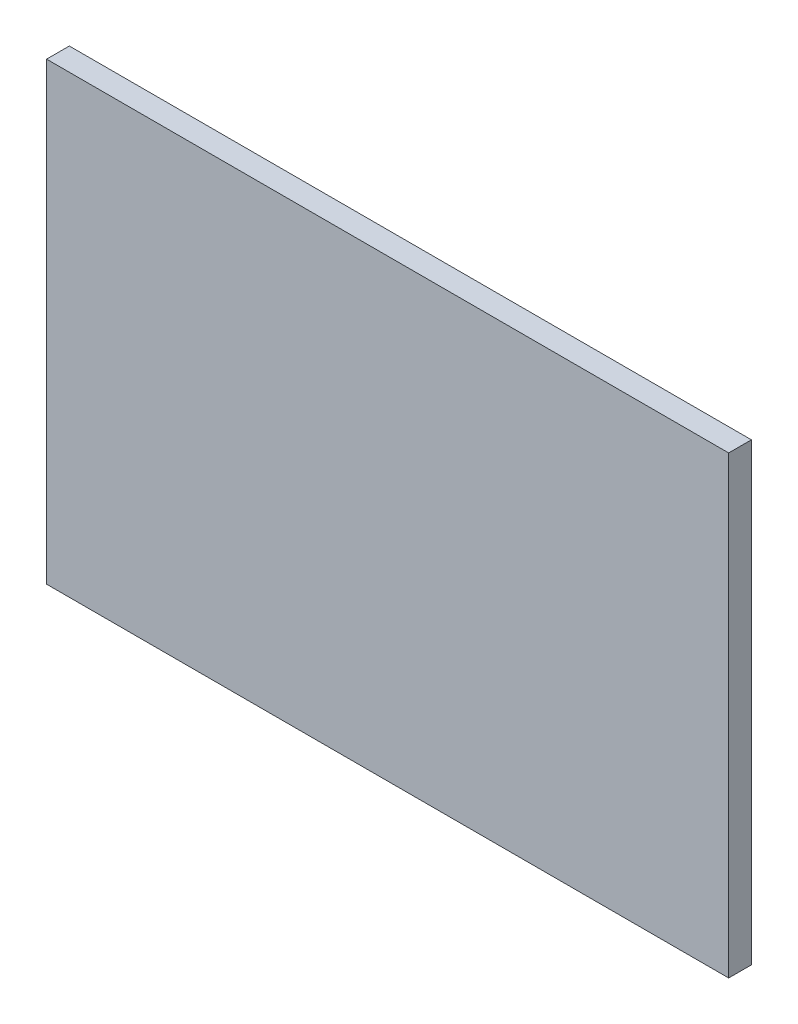
ISO-10303-21;
HEADER;
FILE_DESCRIPTION(('STEP AP214'),'2;1');
FILE_NAME('part.step','',(''),(''),'','','');
FILE_SCHEMA(('AUTOMOTIVE_DESIGN { 1 0 10303 214 1 1 1 1 }'));
ENDSEC;
DATA;
#1=APPLICATION_CONTEXT('core data for automotive mechanical design processes');
#2=APPLICATION_PROTOCOL_DEFINITION('international standard','automotive_design',2000,#1);
#3=PRODUCT_CONTEXT('',#1,'mechanical');
#4=PRODUCT('Part','Part','',(#3));
#5=PRODUCT_RELATED_PRODUCT_CATEGORY('part','',(#4));
#6=PRODUCT_DEFINITION_FORMATION('','',#4);
#7=PRODUCT_DEFINITION_CONTEXT('part definition',#1,'design');
#8=PRODUCT_DEFINITION('design','',#6,#7);
#9=PRODUCT_DEFINITION_SHAPE('','',#8);
#10=(LENGTH_UNIT() NAMED_UNIT(*) SI_UNIT(.MILLI.,.METRE.));
#11=(NAMED_UNIT(*) PLANE_ANGLE_UNIT() SI_UNIT($,.RADIAN.));
#12=(NAMED_UNIT(*) SI_UNIT($,.STERADIAN.) SOLID_ANGLE_UNIT());
#13=UNCERTAINTY_MEASURE_WITH_UNIT(LENGTH_MEASURE(1.E-05),#10,'distance_accuracy_value','');
#14=(GEOMETRIC_REPRESENTATION_CONTEXT(3) GLOBAL_UNCERTAINTY_ASSIGNED_CONTEXT((#13)) GLOBAL_UNIT_ASSIGNED_CONTEXT((#10,
#11,#12)) REPRESENTATION_CONTEXT('',''));
#15=CARTESIAN_POINT('',(0.,0.,0.));
#16=DIRECTION('',(0.,0.,1.));
#17=DIRECTION('',(1.,0.,0.));
#18=AXIS2_PLACEMENT_3D('',#15,#16,#17);
#19=CARTESIAN_POINT('',(0.,0.,1.));
#20=DIRECTION('',(0.,0.,1.));
#21=DIRECTION('',(0.,-1.,0.));
#22=AXIS2_PLACEMENT_3D('',#19,#20,#21);
#23=PLANE('',#22);
#24=DIRECTION('',(1.,0.,0.));
#25=VECTOR('',#24,1.);
#26=CARTESIAN_POINT('',(15.,9.99999999999996,0.999999999999965));
#27=LINE('',#26,#25);
#28=CARTESIAN_POINT('',(-15.,10.0000000000001,0.999999999999965));
#29=VERTEX_POINT('',#28);
#30=CARTESIAN_POINT('',(15.,9.99999999999996,0.999999999999965));
#31=VERTEX_POINT('',#30);
#32=EDGE_CURVE('E127',#29,#31,#27,.T.);
#33=ORIENTED_EDGE('',*,*,#32,.F.);
#34=DIRECTION('',(0.,1.,0.));
#35=VECTOR('',#34,1.);
#36=CARTESIAN_POINT('',(-15.,10.0000000000001,0.999999999999965));
#37=LINE('',#36,#35);
#38=CARTESIAN_POINT('',(-15.,-9.99999999999995,1.00000000000003));
#39=VERTEX_POINT('',#38);
#40=EDGE_CURVE('E125',#39,#29,#37,.T.);
#41=ORIENTED_EDGE('',*,*,#40,.F.);
#42=DIRECTION('',(-1.,0.,0.));
#43=VECTOR('',#42,1.);
#44=CARTESIAN_POINT('',(-15.,-9.99999999999995,1.00000000000003));
#45=LINE('',#44,#43);
#46=CARTESIAN_POINT('',(15.,-10.,1.00000000000003));
#47=VERTEX_POINT('',#46);
#48=EDGE_CURVE('E61',#47,#39,#45,.T.);
#49=ORIENTED_EDGE('',*,*,#48,.F.);
#50=DIRECTION('',(0.,-1.,0.));
#51=VECTOR('',#50,1.);
#52=CARTESIAN_POINT('',(15.,-10.,1.00000000000003));
#53=LINE('',#52,#51);
#54=EDGE_CURVE('E12',#31,#47,#53,.T.);
#55=ORIENTED_EDGE('',*,*,#54,.F.);
#56=EDGE_LOOP('',(#33,#41,#49,#55));
#57=FACE_BOUND('',#56,.T.);
#58=ADVANCED_FACE('F51',(#57),#23,.T.);
#59=CARTESIAN_POINT('',(0.,0.,0.));
#60=DIRECTION('',(0.,0.,1.));
#61=DIRECTION('',(1.,0.,0.));
#62=AXIS2_PLACEMENT_3D('',#59,#60,#61);
#63=PLANE('',#62);
#64=DIRECTION('',(-1.,0.,0.));
#65=VECTOR('',#64,1.);
#66=CARTESIAN_POINT('',(15.,10.,0.));
#67=LINE('',#66,#65);
#68=CARTESIAN_POINT('',(15.,10.,0.));
#69=VERTEX_POINT('',#68);
#70=CARTESIAN_POINT('',(-15.,10.,0.));
#71=VERTEX_POINT('',#70);
#72=EDGE_CURVE('E100',#69,#71,#67,.T.);
#73=ORIENTED_EDGE('',*,*,#72,.F.);
#74=DIRECTION('',(0.,1.,0.));
#75=VECTOR('',#74,1.);
#76=CARTESIAN_POINT('',(15.,-10.,0.));
#77=LINE('',#76,#75);
#78=CARTESIAN_POINT('',(15.,-10.,0.));
#79=VERTEX_POINT('',#78);
#80=EDGE_CURVE('E179',#79,#69,#77,.T.);
#81=ORIENTED_EDGE('',*,*,#80,.F.);
#82=DIRECTION('',(1.,0.,0.));
#83=VECTOR('',#82,1.);
#84=CARTESIAN_POINT('',(-15.,-10.,0.));
#85=LINE('',#84,#83);
#86=CARTESIAN_POINT('',(-15.,-10.,0.));
#87=VERTEX_POINT('',#86);
#88=EDGE_CURVE('E102',#87,#79,#85,.T.);
#89=ORIENTED_EDGE('',*,*,#88,.F.);
#90=DIRECTION('',(0.,-1.,0.));
#91=VECTOR('',#90,1.);
#92=CARTESIAN_POINT('',(-15.,10.,0.));
#93=LINE('',#92,#91);
#94=EDGE_CURVE('E96',#71,#87,#93,.T.);
#95=ORIENTED_EDGE('',*,*,#94,.F.);
#96=EDGE_LOOP('',(#73,#81,#89,#95));
#97=FACE_BOUND('',#96,.T.);
#98=ADVANCED_FACE('F99',(#97),#63,.F.);
#99=CARTESIAN_POINT('',(0.,-9.99999999999995,-4.6837533851372E-13));
#100=DIRECTION('',(0.,-1.,0.));
#101=DIRECTION('',(0.,0.,-1.));
#102=AXIS2_PLACEMENT_3D('',#99,#100,#101);
#103=PLANE('',#102);
#104=DIRECTION('',(0.,0.,1.));
#105=VECTOR('',#104,1.);
#106=CARTESIAN_POINT('',(15.,-10.,0.));
#107=LINE('',#106,#105);
#108=EDGE_CURVE('E76',#79,#47,#107,.T.);
#109=ORIENTED_EDGE('',*,*,#108,.T.);
#110=ORIENTED_EDGE('',*,*,#48,.T.);
#111=DIRECTION('',(0.,0.,1.));
#112=VECTOR('',#111,1.);
#113=CARTESIAN_POINT('',(-15.,-10.,0.));
#114=LINE('',#113,#112);
#115=EDGE_CURVE('E130',#87,#39,#114,.T.);
#116=ORIENTED_EDGE('',*,*,#115,.F.);
#117=ORIENTED_EDGE('',*,*,#88,.T.);
#118=EDGE_LOOP('',(#109,#110,#116,#117));
#119=FACE_BOUND('',#118,.T.);
#120=ADVANCED_FACE('F152',(#119),#103,.T.);
#121=CARTESIAN_POINT('',(-15.,0.,-6.24500451351627E-13));
#122=DIRECTION('',(-1.,0.,0.));
#123=DIRECTION('',(0.,0.,1.));
#124=AXIS2_PLACEMENT_3D('',#121,#122,#123);
#125=PLANE('',#124);
#126=ORIENTED_EDGE('',*,*,#115,.T.);
#127=ORIENTED_EDGE('',*,*,#40,.T.);
#128=DIRECTION('',(0.,0.,1.));
#129=VECTOR('',#128,1.);
#130=CARTESIAN_POINT('',(-15.,10.,0.));
#131=LINE('',#130,#129);
#132=EDGE_CURVE('E116',#71,#29,#131,.T.);
#133=ORIENTED_EDGE('',*,*,#132,.F.);
#134=ORIENTED_EDGE('',*,*,#94,.T.);
#135=EDGE_LOOP('',(#126,#127,#133,#134));
#136=FACE_BOUND('',#135,.T.);
#137=ADVANCED_FACE('F123',(#136),#125,.T.);
#138=CARTESIAN_POINT('',(15.,0.,-5.98479599212018E-13));
#139=DIRECTION('',(1.,0.,0.));
#140=DIRECTION('',(0.,0.,-1.));
#141=AXIS2_PLACEMENT_3D('',#138,#139,#140);
#142=PLANE('',#141);
#143=DIRECTION('',(0.,0.,1.));
#144=VECTOR('',#143,1.);
#145=CARTESIAN_POINT('',(15.,10.,0.));
#146=LINE('',#145,#144);
#147=EDGE_CURVE('E118',#69,#31,#146,.T.);
#148=ORIENTED_EDGE('',*,*,#147,.T.);
#149=ORIENTED_EDGE('',*,*,#54,.T.);
#150=ORIENTED_EDGE('',*,*,#108,.F.);
#151=ORIENTED_EDGE('',*,*,#80,.T.);
#152=EDGE_LOOP('',(#148,#149,#150,#151));
#153=FACE_BOUND('',#152,.T.);
#154=ADVANCED_FACE('F151',(#153),#142,.T.);
#155=CARTESIAN_POINT('',(0.,9.99999999999995,-5.72458747072365E-13));
#156=DIRECTION('',(0.,1.,0.));
#157=DIRECTION('',(0.,0.,1.));
#158=AXIS2_PLACEMENT_3D('',#155,#156,#157);
#159=PLANE('',#158);
#160=ORIENTED_EDGE('',*,*,#132,.T.);
#161=ORIENTED_EDGE('',*,*,#32,.T.);
#162=ORIENTED_EDGE('',*,*,#147,.F.);
#163=ORIENTED_EDGE('',*,*,#72,.T.);
#164=EDGE_LOOP('',(#160,#161,#162,#163));
#165=FACE_BOUND('',#164,.T.);
#166=ADVANCED_FACE('F115',(#165),#159,.T.);
#167=CLOSED_SHELL('',(#58,#98,#120,#137,#154,#166));
#168=MANIFOLD_SOLID_BREP('B2',#167);
#169=ADVANCED_BREP_SHAPE_REPRESENTATION('',(#18,#168),#14);
#170=SHAPE_DEFINITION_REPRESENTATION(#9,#169);
ENDSEC;
END-ISO-10303-21;
